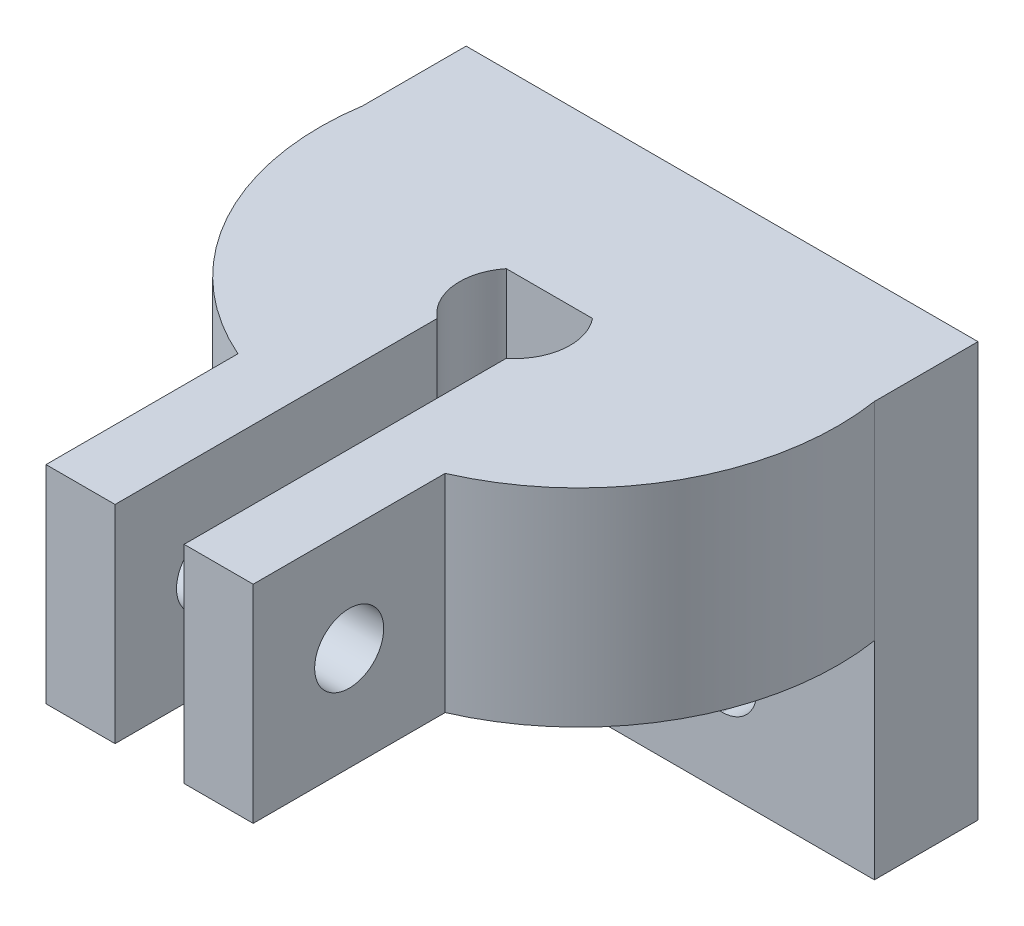
ISO-10303-21;
HEADER;
FILE_DESCRIPTION(('STEP AP214'),'2;1');
FILE_NAME('part.step','',(''),(''),'','','');
FILE_SCHEMA(('AUTOMOTIVE_DESIGN { 1 0 10303 214 1 1 1 1 }'));
ENDSEC;
DATA;
#1=APPLICATION_CONTEXT('core data for automotive mechanical design processes');
#2=APPLICATION_PROTOCOL_DEFINITION('international standard','automotive_design',2000,#1);
#3=PRODUCT_CONTEXT('',#1,'mechanical');
#4=PRODUCT('Part','Part','',(#3));
#5=PRODUCT_RELATED_PRODUCT_CATEGORY('part','',(#4));
#6=PRODUCT_DEFINITION_FORMATION('','',#4);
#7=PRODUCT_DEFINITION_CONTEXT('part definition',#1,'design');
#8=PRODUCT_DEFINITION('design','',#6,#7);
#9=PRODUCT_DEFINITION_SHAPE('','',#8);
#10=(LENGTH_UNIT() NAMED_UNIT(*) SI_UNIT(.MILLI.,.METRE.));
#11=(NAMED_UNIT(*) PLANE_ANGLE_UNIT() SI_UNIT($,.RADIAN.));
#12=(NAMED_UNIT(*) SI_UNIT($,.STERADIAN.) SOLID_ANGLE_UNIT());
#13=UNCERTAINTY_MEASURE_WITH_UNIT(LENGTH_MEASURE(1.E-05),#10,'distance_accuracy_value','');
#14=(GEOMETRIC_REPRESENTATION_CONTEXT(3) GLOBAL_UNCERTAINTY_ASSIGNED_CONTEXT((#13)) GLOBAL_UNIT_ASSIGNED_CONTEXT((#10,
#11,#12)) REPRESENTATION_CONTEXT('',''));
#15=CARTESIAN_POINT('',(0.,0.,0.));
#16=DIRECTION('',(0.,0.,1.));
#17=DIRECTION('',(1.,0.,0.));
#18=AXIS2_PLACEMENT_3D('',#15,#16,#17);
#19=CARTESIAN_POINT('',(0.,6.,0.));
#20=DIRECTION('',(0.,-1.,0.));
#21=DIRECTION('',(0.,0.,-1.));
#22=AXIS2_PLACEMENT_3D('',#19,#20,#21);
#23=CYLINDRICAL_SURFACE('',#22,7.5);
#24=DIRECTION('',(0.,-1.,0.));
#25=VECTOR('',#24,1.);
#26=CARTESIAN_POINT('',(3.,6.,6.87386354243376));
#27=LINE('',#26,#25);
#28=CARTESIAN_POINT('',(3.,0.,6.87386354243376));
#29=VERTEX_POINT('',#28);
#30=CARTESIAN_POINT('',(3.,6.,6.87386354243376));
#31=VERTEX_POINT('',#30);
#32=EDGE_CURVE('E196',#29,#31,#27,.F.);
#33=ORIENTED_EDGE('',*,*,#32,.F.);
#34=CARTESIAN_POINT('',(0.,0.,0.));
#35=DIRECTION('',(0.,1.,0.));
#36=DIRECTION('',(0.,0.,1.));
#37=AXIS2_PLACEMENT_3D('',#34,#35,#36);
#38=CIRCLE('',#37,7.5);
#39=CARTESIAN_POINT('',(7.41196235336267,0.,-1.14578098794425));
#40=VERTEX_POINT('',#39);
#41=EDGE_CURVE('E188',#29,#40,#38,.T.);
#42=ORIENTED_EDGE('',*,*,#41,.T.);
#43=DIRECTION('',(0.,-1.,0.));
#44=VECTOR('',#43,1.);
#45=CARTESIAN_POINT('',(7.41196235336267,21.1244419305527,-1.14578098794425));
#46=LINE('',#45,#44);
#47=CARTESIAN_POINT('',(7.41196235336267,6.,-1.14578098794425));
#48=VERTEX_POINT('',#47);
#49=EDGE_CURVE('E270',#48,#40,#46,.T.);
#50=ORIENTED_EDGE('',*,*,#49,.F.);
#51=CARTESIAN_POINT('',(0.,6.,0.));
#52=DIRECTION('',(0.,1.,0.));
#53=DIRECTION('',(0.,0.,1.));
#54=AXIS2_PLACEMENT_3D('',#51,#52,#53);
#55=CIRCLE('',#54,7.5);
#56=EDGE_CURVE('E314',#31,#48,#55,.T.);
#57=ORIENTED_EDGE('',*,*,#56,.F.);
#58=EDGE_LOOP('',(#33,#42,#50,#57));
#59=FACE_BOUND('',#58,.T.);
#60=ADVANCED_FACE('F35',(#59),#23,.T.);
#61=DIRECTION('',(0.,-1.,0.));
#62=VECTOR('',#61,1.);
#63=CARTESIAN_POINT('',(-3.,6.,6.87386354243376));
#64=LINE('',#63,#62);
#65=CARTESIAN_POINT('',(-3.,6.,6.87386354243376));
#66=VERTEX_POINT('',#65);
#67=CARTESIAN_POINT('',(-3.,0.,6.87386354243376));
#68=VERTEX_POINT('',#67);
#69=EDGE_CURVE('E54',#66,#68,#64,.T.);
#70=ORIENTED_EDGE('',*,*,#69,.F.);
#71=CARTESIAN_POINT('',(-7.41196235336267,6.,-1.14578098794425));
#72=VERTEX_POINT('',#71);
#73=EDGE_CURVE('E311',#72,#66,#55,.T.);
#74=ORIENTED_EDGE('',*,*,#73,.F.);
#75=DIRECTION('',(0.,-1.,0.));
#76=VECTOR('',#75,1.);
#77=CARTESIAN_POINT('',(-7.41196235336267,21.1244419305527,-1.14578098794425));
#78=LINE('',#77,#76);
#79=CARTESIAN_POINT('',(-7.41196235336267,0.,-1.14578098794425));
#80=VERTEX_POINT('',#79);
#81=EDGE_CURVE('E274',#72,#80,#78,.T.);
#82=ORIENTED_EDGE('',*,*,#81,.T.);
#83=EDGE_CURVE('E50',#80,#68,#38,.T.);
#84=ORIENTED_EDGE('',*,*,#83,.T.);
#85=EDGE_LOOP('',(#70,#74,#82,#84));
#86=FACE_BOUND('',#85,.T.);
#87=ADVANCED_FACE('F353',(#86),#23,.T.);
#88=CARTESIAN_POINT('',(0.,-2.,1.85421901205575));
#89=DIRECTION('',(0.,1.,0.));
#90=DIRECTION('',(0.,0.,1.));
#91=AXIS2_PLACEMENT_3D('',#88,#89,#90);
#92=CYLINDRICAL_SURFACE('',#91,1.6);
#93=CARTESIAN_POINT('',(0.,6.,1.85421901205575));
#94=DIRECTION('',(0.,1.,0.));
#95=DIRECTION('',(0.,0.,1.));
#96=AXIS2_PLACEMENT_3D('',#93,#94,#95);
#97=CIRCLE('',#96,1.6);
#98=CARTESIAN_POINT('',(-1.24899959967968,6.,0.854219012055751));
#99=VERTEX_POINT('',#98);
#100=CARTESIAN_POINT('',(-1.,6.,3.10321861173543));
#101=VERTEX_POINT('',#100);
#102=EDGE_CURVE('E281',#99,#101,#97,.T.);
#103=ORIENTED_EDGE('',*,*,#102,.T.);
#104=DIRECTION('',(0.,1.,0.));
#105=VECTOR('',#104,1.);
#106=CARTESIAN_POINT('',(-1.,-2.,3.10321861173543));
#107=LINE('',#106,#105);
#108=CARTESIAN_POINT('',(-1.,0.,3.10321861173543));
#109=VERTEX_POINT('',#108);
#110=EDGE_CURVE('E11',#101,#109,#107,.F.);
#111=ORIENTED_EDGE('',*,*,#110,.T.);
#112=CARTESIAN_POINT('',(0.,0.,1.85421901205575));
#113=DIRECTION('',(0.,1.,0.));
#114=DIRECTION('',(0.,0.,1.));
#115=AXIS2_PLACEMENT_3D('',#112,#113,#114);
#116=CIRCLE('',#115,1.6);
#117=CARTESIAN_POINT('',(-1.24899959967968,0.,0.854219012055751));
#118=VERTEX_POINT('',#117);
#119=EDGE_CURVE('E296',#118,#109,#116,.T.);
#120=ORIENTED_EDGE('',*,*,#119,.F.);
#121=DIRECTION('',(0.,1.,0.));
#122=VECTOR('',#121,1.);
#123=CARTESIAN_POINT('',(-1.24899959967968,-2.,0.854219012055751));
#124=LINE('',#123,#122);
#125=EDGE_CURVE('E288',#118,#99,#124,.T.);
#126=ORIENTED_EDGE('',*,*,#125,.T.);
#127=EDGE_LOOP('',(#103,#111,#120,#126));
#128=FACE_BOUND('',#127,.T.);
#129=ADVANCED_FACE('F358',(#128),#92,.F.);
#130=CARTESIAN_POINT('',(0.,0.,0.));
#131=DIRECTION('',(0.,1.,0.));
#132=DIRECTION('',(0.,0.,1.));
#133=AXIS2_PLACEMENT_3D('',#130,#131,#132);
#134=PLANE('',#133);
#135=DIRECTION('',(0.,0.,-1.));
#136=VECTOR('',#135,1.);
#137=CARTESIAN_POINT('',(1.,0.,0.));
#138=LINE('',#137,#136);
#139=CARTESIAN_POINT('',(0.999999999999999,0.,12.4330343736593));
#140=VERTEX_POINT('',#139);
#141=CARTESIAN_POINT('',(1.,0.,3.10321861173543));
#142=VERTEX_POINT('',#141);
#143=EDGE_CURVE('E221',#140,#142,#138,.T.);
#144=ORIENTED_EDGE('',*,*,#143,.T.);
#145=CARTESIAN_POINT('',(1.24899959967968,0.,0.854219012055751));
#146=VERTEX_POINT('',#145);
#147=EDGE_CURVE('E295',#142,#146,#116,.T.);
#148=ORIENTED_EDGE('',*,*,#147,.T.);
#149=DIRECTION('',(-1.,0.,0.));
#150=VECTOR('',#149,1.);
#151=CARTESIAN_POINT('',(0.,0.,0.854219012055751));
#152=LINE('',#151,#150);
#153=EDGE_CURVE('E290',#146,#118,#152,.T.);
#154=ORIENTED_EDGE('',*,*,#153,.T.);
#155=ORIENTED_EDGE('',*,*,#119,.T.);
#156=DIRECTION('',(0.,0.,1.));
#157=VECTOR('',#156,1.);
#158=CARTESIAN_POINT('',(-1.,0.,0.));
#159=LINE('',#158,#157);
#160=CARTESIAN_POINT('',(-0.999999999999999,0.,12.4330343736593));
#161=VERTEX_POINT('',#160);
#162=EDGE_CURVE('E223',#109,#161,#159,.T.);
#163=ORIENTED_EDGE('',*,*,#162,.T.);
#164=DIRECTION('',(1.,0.,0.));
#165=VECTOR('',#164,1.);
#166=CARTESIAN_POINT('',(-3.,0.,12.4330343736593));
#167=LINE('',#166,#165);
#168=CARTESIAN_POINT('',(-3.,0.,12.4330343736593));
#169=VERTEX_POINT('',#168);
#170=EDGE_CURVE('E211',#169,#161,#167,.T.);
#171=ORIENTED_EDGE('',*,*,#170,.F.);
#172=DIRECTION('',(0.,0.,-1.));
#173=VECTOR('',#172,1.);
#174=CARTESIAN_POINT('',(-3.,0.,5.43303437365925));
#175=LINE('',#174,#173);
#176=EDGE_CURVE('E205',#169,#68,#175,.T.);
#177=ORIENTED_EDGE('',*,*,#176,.T.);
#178=ORIENTED_EDGE('',*,*,#83,.F.);
#179=DIRECTION('',(-1.,0.,0.));
#180=VECTOR('',#179,1.);
#181=CARTESIAN_POINT('',(-7.41196235336267,0.,-1.14578098794425));
#182=LINE('',#181,#180);
#183=EDGE_CURVE('E299',#40,#80,#182,.T.);
#184=ORIENTED_EDGE('',*,*,#183,.F.);
#185=ORIENTED_EDGE('',*,*,#41,.F.);
#186=DIRECTION('',(0.,0.,-1.));
#187=VECTOR('',#186,1.);
#188=CARTESIAN_POINT('',(3.,0.,5.43303437365925));
#189=LINE('',#188,#187);
#190=CARTESIAN_POINT('',(3.,0.,12.4330343736593));
#191=VERTEX_POINT('',#190);
#192=EDGE_CURVE('E168',#191,#29,#189,.T.);
#193=ORIENTED_EDGE('',*,*,#192,.F.);
#194=DIRECTION('',(-1.,0.,0.));
#195=VECTOR('',#194,1.);
#196=CARTESIAN_POINT('',(3.,0.,12.4330343736593));
#197=LINE('',#196,#195);
#198=EDGE_CURVE('E178',#191,#140,#197,.T.);
#199=ORIENTED_EDGE('',*,*,#198,.T.);
#200=EDGE_LOOP('',(#144,#148,#154,#155,#163,#171,#177,#178,#184,#185,#193,#199));
#201=FACE_BOUND('',#200,.T.);
#202=ADVANCED_FACE('F186',(#201),#134,.F.);
#203=CARTESIAN_POINT('',(-6.25,6.,-4.14578098794425));
#204=DIRECTION('',(0.,0.,1.));
#205=DIRECTION('',(1.,0.,0.));
#206=AXIS2_PLACEMENT_3D('',#203,#204,#205);
#207=PLANE('',#206);
#208=DIRECTION('',(-1.,0.,0.));
#209=VECTOR('',#208,1.);
#210=CARTESIAN_POINT('',(-6.25,-2.,-4.14578098794425));
#211=LINE('',#210,#209);
#212=CARTESIAN_POINT('',(3.,-2.,-4.14578098794425));
#213=VERTEX_POINT('',#212);
#214=CARTESIAN_POINT('',(-3.,-2.,-4.14578098794425));
#215=VERTEX_POINT('',#214);
#216=EDGE_CURVE('E251',#213,#215,#211,.T.);
#217=ORIENTED_EDGE('',*,*,#216,.T.);
#218=CARTESIAN_POINT('',(-3.,-3.,-4.14578098794425));
#219=DIRECTION('',(0.,0.,1.));
#220=DIRECTION('',(1.,0.,0.));
#221=AXIS2_PLACEMENT_3D('',#218,#219,#220);
#222=CIRCLE('',#221,1.);
#223=CARTESIAN_POINT('',(-3.,-4.,-4.14578098794425));
#224=VERTEX_POINT('',#223);
#225=EDGE_CURVE('E254',#215,#224,#222,.T.);
#226=ORIENTED_EDGE('',*,*,#225,.T.);
#227=DIRECTION('',(1.,0.,0.));
#228=VECTOR('',#227,1.);
#229=CARTESIAN_POINT('',(-6.25,-4.,-4.14578098794425));
#230=LINE('',#229,#228);
#231=CARTESIAN_POINT('',(3.,-4.,-4.14578098794425));
#232=VERTEX_POINT('',#231);
#233=EDGE_CURVE('E239',#224,#232,#230,.T.);
#234=ORIENTED_EDGE('',*,*,#233,.T.);
#235=CARTESIAN_POINT('',(3.,-3.,-4.14578098794425));
#236=DIRECTION('',(0.,0.,1.));
#237=DIRECTION('',(1.,0.,0.));
#238=AXIS2_PLACEMENT_3D('',#235,#236,#237);
#239=CIRCLE('',#238,1.);
#240=EDGE_CURVE('E248',#232,#213,#239,.T.);
#241=ORIENTED_EDGE('',*,*,#240,.T.);
#242=EDGE_LOOP('',(#217,#226,#234,#241));
#243=FACE_BOUND('',#242,.T.);
#244=DIRECTION('',(-1.,0.,0.));
#245=VECTOR('',#244,1.);
#246=CARTESIAN_POINT('',(-6.25,6.,-4.14578098794425));
#247=LINE('',#246,#245);
#248=CARTESIAN_POINT('',(7.41196235336267,6.,-4.14578098794425));
#249=VERTEX_POINT('',#248);
#250=CARTESIAN_POINT('',(-7.41196235336267,6.,-4.14578098794425));
#251=VERTEX_POINT('',#250);
#252=EDGE_CURVE('E313',#249,#251,#247,.T.);
#253=ORIENTED_EDGE('',*,*,#252,.F.);
#254=DIRECTION('',(0.,-1.,0.));
#255=VECTOR('',#254,1.);
#256=CARTESIAN_POINT('',(7.41196235336267,21.1244419305527,-4.14578098794425));
#257=LINE('',#256,#255);
#258=CARTESIAN_POINT('',(7.41196235336267,-6.,-4.14578098794425));
#259=VERTEX_POINT('',#258);
#260=EDGE_CURVE('E271',#249,#259,#257,.T.);
#261=ORIENTED_EDGE('',*,*,#260,.T.);
#262=DIRECTION('',(1.,0.,0.));
#263=VECTOR('',#262,1.);
#264=CARTESIAN_POINT('',(6.25,-6.,-4.14578098794425));
#265=LINE('',#264,#263);
#266=CARTESIAN_POINT('',(-7.41196235336267,-6.,-4.14578098794425));
#267=VERTEX_POINT('',#266);
#268=EDGE_CURVE('E302',#267,#259,#265,.T.);
#269=ORIENTED_EDGE('',*,*,#268,.F.);
#270=DIRECTION('',(0.,-1.,0.));
#271=VECTOR('',#270,1.);
#272=CARTESIAN_POINT('',(-7.41196235336267,21.1244419305527,-4.14578098794425));
#273=LINE('',#272,#271);
#274=EDGE_CURVE('E266',#251,#267,#273,.T.);
#275=ORIENTED_EDGE('',*,*,#274,.F.);
#276=EDGE_LOOP('',(#253,#261,#269,#275));
#277=FACE_BOUND('',#276,.T.);
#278=ADVANCED_FACE('F367',(#243,#277),#207,.F.);
#279=CARTESIAN_POINT('',(0.,6.,0.));
#280=DIRECTION('',(0.,1.,0.));
#281=DIRECTION('',(0.,0.,1.));
#282=AXIS2_PLACEMENT_3D('',#279,#280,#281);
#283=PLANE('',#282);
#284=CARTESIAN_POINT('',(1.,6.,3.10321861173543));
#285=VERTEX_POINT('',#284);
#286=CARTESIAN_POINT('',(1.24899959967968,6.,0.854219012055751));
#287=VERTEX_POINT('',#286);
#288=EDGE_CURVE('E280',#285,#287,#97,.T.);
#289=ORIENTED_EDGE('',*,*,#288,.F.);
#290=DIRECTION('',(0.,0.,-1.));
#291=VECTOR('',#290,1.);
#292=CARTESIAN_POINT('',(1.,6.,3.10321861173543));
#293=LINE('',#292,#291);
#294=CARTESIAN_POINT('',(0.999999999999999,6.,12.4330343736593));
#295=VERTEX_POINT('',#294);
#296=EDGE_CURVE('E217',#295,#285,#293,.T.);
#297=ORIENTED_EDGE('',*,*,#296,.F.);
#298=DIRECTION('',(-1.,0.,0.));
#299=VECTOR('',#298,1.);
#300=CARTESIAN_POINT('',(3.,6.,12.4330343736593));
#301=LINE('',#300,#299);
#302=CARTESIAN_POINT('',(3.,6.,12.4330343736593));
#303=VERTEX_POINT('',#302);
#304=EDGE_CURVE('E183',#303,#295,#301,.T.);
#305=ORIENTED_EDGE('',*,*,#304,.F.);
#306=DIRECTION('',(0.,0.,1.));
#307=VECTOR('',#306,1.);
#308=CARTESIAN_POINT('',(3.,6.,5.43303437365925));
#309=LINE('',#308,#307);
#310=EDGE_CURVE('E171',#31,#303,#309,.T.);
#311=ORIENTED_EDGE('',*,*,#310,.F.);
#312=ORIENTED_EDGE('',*,*,#56,.T.);
#313=DIRECTION('',(0.,0.,1.));
#314=VECTOR('',#313,1.);
#315=CARTESIAN_POINT('',(7.41196235336267,6.,-4.14578098794425));
#316=LINE('',#315,#314);
#317=EDGE_CURVE('E267',#249,#48,#316,.T.);
#318=ORIENTED_EDGE('',*,*,#317,.F.);
#319=ORIENTED_EDGE('',*,*,#252,.T.);
#320=DIRECTION('',(0.,0.,-1.));
#321=VECTOR('',#320,1.);
#322=CARTESIAN_POINT('',(-7.41196235336267,6.,-1.14578098794425));
#323=LINE('',#322,#321);
#324=EDGE_CURVE('E261',#72,#251,#323,.T.);
#325=ORIENTED_EDGE('',*,*,#324,.F.);
#326=ORIENTED_EDGE('',*,*,#73,.T.);
#327=DIRECTION('',(0.,0.,1.));
#328=VECTOR('',#327,1.);
#329=CARTESIAN_POINT('',(-3.,6.,5.43303437365925));
#330=LINE('',#329,#328);
#331=CARTESIAN_POINT('',(-3.,6.,12.4330343736593));
#332=VERTEX_POINT('',#331);
#333=EDGE_CURVE('E200',#66,#332,#330,.T.);
#334=ORIENTED_EDGE('',*,*,#333,.T.);
#335=DIRECTION('',(1.,0.,0.));
#336=VECTOR('',#335,1.);
#337=CARTESIAN_POINT('',(-3.,6.,12.4330343736593));
#338=LINE('',#337,#336);
#339=CARTESIAN_POINT('',(-0.999999999999999,6.,12.4330343736593));
#340=VERTEX_POINT('',#339);
#341=EDGE_CURVE('E208',#332,#340,#338,.T.);
#342=ORIENTED_EDGE('',*,*,#341,.T.);
#343=DIRECTION('',(0.,0.,1.));
#344=VECTOR('',#343,1.);
#345=CARTESIAN_POINT('',(-1.,6.,7.43303437365925));
#346=LINE('',#345,#344);
#347=EDGE_CURVE('E219',#101,#340,#346,.T.);
#348=ORIENTED_EDGE('',*,*,#347,.F.);
#349=ORIENTED_EDGE('',*,*,#102,.F.);
#350=DIRECTION('',(-1.,0.,0.));
#351=VECTOR('',#350,1.);
#352=CARTESIAN_POINT('',(-1.24899959967968,6.,0.854219012055751));
#353=LINE('',#352,#351);
#354=EDGE_CURVE('E284',#287,#99,#353,.T.);
#355=ORIENTED_EDGE('',*,*,#354,.F.);
#356=EDGE_LOOP('',(#289,#297,#305,#311,#312,#318,#319,#325,#326,#334,#342,#348,#349,#355));
#357=FACE_BOUND('',#356,.T.);
#358=ADVANCED_FACE('F327',(#357),#283,.T.);
#359=CARTESIAN_POINT('',(-7.41196235336267,-6.,-1.14578098794425));
#360=DIRECTION('',(0.,0.,-1.));
#361=DIRECTION('',(-1.,0.,0.));
#362=AXIS2_PLACEMENT_3D('',#359,#360,#361);
#363=PLANE('',#362);
#364=DIRECTION('',(1.,0.,0.));
#365=VECTOR('',#364,1.);
#366=CARTESIAN_POINT('',(3.,-4.,-1.14578098794425));
#367=LINE('',#366,#365);
#368=CARTESIAN_POINT('',(-3.,-4.,-1.14578098794425));
#369=VERTEX_POINT('',#368);
#370=CARTESIAN_POINT('',(3.,-4.,-1.14578098794425));
#371=VERTEX_POINT('',#370);
#372=EDGE_CURVE('E227',#369,#371,#367,.T.);
#373=ORIENTED_EDGE('',*,*,#372,.F.);
#374=CARTESIAN_POINT('',(-3.,-3.,-1.14578098794425));
#375=DIRECTION('',(0.,0.,1.));
#376=DIRECTION('',(1.,0.,0.));
#377=AXIS2_PLACEMENT_3D('',#374,#375,#376);
#378=CIRCLE('',#377,1.);
#379=CARTESIAN_POINT('',(-3.,-2.,-1.14578098794425));
#380=VERTEX_POINT('',#379);
#381=EDGE_CURVE('E225',#380,#369,#378,.T.);
#382=ORIENTED_EDGE('',*,*,#381,.F.);
#383=DIRECTION('',(-1.,0.,0.));
#384=VECTOR('',#383,1.);
#385=CARTESIAN_POINT('',(-3.,-2.,-1.14578098794425));
#386=LINE('',#385,#384);
#387=CARTESIAN_POINT('',(3.,-2.,-1.14578098794425));
#388=VERTEX_POINT('',#387);
#389=EDGE_CURVE('E233',#388,#380,#386,.T.);
#390=ORIENTED_EDGE('',*,*,#389,.F.);
#391=CARTESIAN_POINT('',(3.,-3.,-1.14578098794425));
#392=DIRECTION('',(0.,0.,1.));
#393=DIRECTION('',(1.,0.,0.));
#394=AXIS2_PLACEMENT_3D('',#391,#392,#393);
#395=CIRCLE('',#394,1.);
#396=EDGE_CURVE('E230',#371,#388,#395,.T.);
#397=ORIENTED_EDGE('',*,*,#396,.F.);
#398=EDGE_LOOP('',(#373,#382,#390,#397));
#399=FACE_BOUND('',#398,.T.);
#400=ORIENTED_EDGE('',*,*,#183,.T.);
#401=DIRECTION('',(0.,1.,0.));
#402=VECTOR('',#401,1.);
#403=CARTESIAN_POINT('',(-7.41196235336267,-6.,-1.14578098794425));
#404=LINE('',#403,#402);
#405=CARTESIAN_POINT('',(-7.41196235336267,-6.,-1.14578098794425));
#406=VERTEX_POINT('',#405);
#407=EDGE_CURVE('E304',#406,#80,#404,.T.);
#408=ORIENTED_EDGE('',*,*,#407,.F.);
#409=DIRECTION('',(-1.,0.,0.));
#410=VECTOR('',#409,1.);
#411=CARTESIAN_POINT('',(-7.41196235336267,-6.,-1.14578098794425));
#412=LINE('',#411,#410);
#413=CARTESIAN_POINT('',(7.41196235336267,-6.,-1.14578098794425));
#414=VERTEX_POINT('',#413);
#415=EDGE_CURVE('E300',#414,#406,#412,.T.);
#416=ORIENTED_EDGE('',*,*,#415,.F.);
#417=DIRECTION('',(0.,1.,0.));
#418=VECTOR('',#417,1.);
#419=CARTESIAN_POINT('',(7.41196235336267,-6.,-1.14578098794425));
#420=LINE('',#419,#418);
#421=EDGE_CURVE('E308',#414,#40,#420,.T.);
#422=ORIENTED_EDGE('',*,*,#421,.T.);
#423=EDGE_LOOP('',(#400,#408,#416,#422));
#424=FACE_BOUND('',#423,.T.);
#425=ADVANCED_FACE('F378',(#399,#424),#363,.F.);
#426=CARTESIAN_POINT('',(0.,-6.,0.));
#427=DIRECTION('',(0.,-1.,0.));
#428=DIRECTION('',(0.,0.,-1.));
#429=AXIS2_PLACEMENT_3D('',#426,#427,#428);
#430=PLANE('',#429);
#431=ORIENTED_EDGE('',*,*,#268,.T.);
#432=DIRECTION('',(0.,0.,1.));
#433=VECTOR('',#432,1.);
#434=CARTESIAN_POINT('',(7.41196235336267,-6.,-4.14578098794425));
#435=LINE('',#434,#433);
#436=EDGE_CURVE('E258',#259,#414,#435,.T.);
#437=ORIENTED_EDGE('',*,*,#436,.T.);
#438=ORIENTED_EDGE('',*,*,#415,.T.);
#439=DIRECTION('',(0.,0.,-1.));
#440=VECTOR('',#439,1.);
#441=CARTESIAN_POINT('',(-7.41196235336267,-6.,-1.14578098794425));
#442=LINE('',#441,#440);
#443=EDGE_CURVE('E257',#406,#267,#442,.T.);
#444=ORIENTED_EDGE('',*,*,#443,.T.);
#445=EDGE_LOOP('',(#431,#437,#438,#444));
#446=FACE_BOUND('',#445,.T.);
#447=ADVANCED_FACE('F397',(#446),#430,.T.);
#448=ORIENTED_EDGE('',*,*,#147,.F.);
#449=DIRECTION('',(0.,1.,0.));
#450=VECTOR('',#449,1.);
#451=CARTESIAN_POINT('',(1.,-2.,3.10321861173543));
#452=LINE('',#451,#450);
#453=EDGE_CURVE('E43',#142,#285,#452,.T.);
#454=ORIENTED_EDGE('',*,*,#453,.T.);
#455=ORIENTED_EDGE('',*,*,#288,.T.);
#456=DIRECTION('',(0.,1.,0.));
#457=VECTOR('',#456,1.);
#458=CARTESIAN_POINT('',(1.24899959967968,-2.,0.854219012055751));
#459=LINE('',#458,#457);
#460=EDGE_CURVE('E287',#146,#287,#459,.T.);
#461=ORIENTED_EDGE('',*,*,#460,.F.);
#462=EDGE_LOOP('',(#448,#454,#455,#461));
#463=FACE_BOUND('',#462,.T.);
#464=ADVANCED_FACE('F322',(#463),#92,.F.);
#465=CARTESIAN_POINT('',(-1.24899959967968,-2.,0.854219012055751));
#466=DIRECTION('',(0.,0.,-1.));
#467=DIRECTION('',(-1.,0.,0.));
#468=AXIS2_PLACEMENT_3D('',#465,#466,#467);
#469=PLANE('',#468);
#470=ORIENTED_EDGE('',*,*,#460,.T.);
#471=ORIENTED_EDGE('',*,*,#354,.T.);
#472=ORIENTED_EDGE('',*,*,#125,.F.);
#473=ORIENTED_EDGE('',*,*,#153,.F.);
#474=EDGE_LOOP('',(#470,#471,#472,#473));
#475=FACE_BOUND('',#474,.T.);
#476=ADVANCED_FACE('F331',(#475),#469,.F.);
#477=CARTESIAN_POINT('',(7.41196235336267,21.1244419305527,-4.14578098794425));
#478=DIRECTION('',(1.,0.,0.));
#479=DIRECTION('',(0.,0.,-1.));
#480=AXIS2_PLACEMENT_3D('',#477,#478,#479);
#481=PLANE('',#480);
#482=ORIENTED_EDGE('',*,*,#260,.F.);
#483=ORIENTED_EDGE('',*,*,#317,.T.);
#484=ORIENTED_EDGE('',*,*,#49,.T.);
#485=ORIENTED_EDGE('',*,*,#421,.F.);
#486=ORIENTED_EDGE('',*,*,#436,.F.);
#487=EDGE_LOOP('',(#482,#483,#484,#485,#486));
#488=FACE_BOUND('',#487,.T.);
#489=ADVANCED_FACE('F364',(#488),#481,.T.);
#490=CARTESIAN_POINT('',(-7.41196235336267,21.1244419305527,-1.14578098794425));
#491=DIRECTION('',(-1.,0.,0.));
#492=DIRECTION('',(0.,0.,1.));
#493=AXIS2_PLACEMENT_3D('',#490,#491,#492);
#494=PLANE('',#493);
#495=ORIENTED_EDGE('',*,*,#81,.F.);
#496=ORIENTED_EDGE('',*,*,#324,.T.);
#497=ORIENTED_EDGE('',*,*,#274,.T.);
#498=ORIENTED_EDGE('',*,*,#443,.F.);
#499=ORIENTED_EDGE('',*,*,#407,.T.);
#500=EDGE_LOOP('',(#495,#496,#497,#498,#499));
#501=FACE_BOUND('',#500,.T.);
#502=ADVANCED_FACE('F373',(#501),#494,.T.);
#503=CARTESIAN_POINT('',(-3.,-3.,-11.1457809879442));
#504=DIRECTION('',(0.,0.,1.));
#505=DIRECTION('',(1.,0.,0.));
#506=AXIS2_PLACEMENT_3D('',#503,#504,#505);
#507=CYLINDRICAL_SURFACE('',#506,1.);
#508=DIRECTION('',(0.,0.,1.));
#509=VECTOR('',#508,1.);
#510=CARTESIAN_POINT('',(-3.,-2.,-11.1457809879442));
#511=LINE('',#510,#509);
#512=EDGE_CURVE('E237',#215,#380,#511,.T.);
#513=ORIENTED_EDGE('',*,*,#512,.T.);
#514=ORIENTED_EDGE('',*,*,#381,.T.);
#515=DIRECTION('',(0.,0.,1.));
#516=VECTOR('',#515,1.);
#517=CARTESIAN_POINT('',(-3.,-4.,-11.1457809879442));
#518=LINE('',#517,#516);
#519=EDGE_CURVE('E236',#224,#369,#518,.T.);
#520=ORIENTED_EDGE('',*,*,#519,.F.);
#521=ORIENTED_EDGE('',*,*,#225,.F.);
#522=EDGE_LOOP('',(#513,#514,#520,#521));
#523=FACE_BOUND('',#522,.T.);
#524=ADVANCED_FACE('F426',(#523),#507,.F.);
#525=CARTESIAN_POINT('',(-3.,-2.,-11.1457809879442));
#526=DIRECTION('',(0.,1.,0.));
#527=DIRECTION('',(0.,0.,1.));
#528=AXIS2_PLACEMENT_3D('',#525,#526,#527);
#529=PLANE('',#528);
#530=DIRECTION('',(0.,0.,1.));
#531=VECTOR('',#530,1.);
#532=CARTESIAN_POINT('',(3.,-2.,-11.1457809879442));
#533=LINE('',#532,#531);
#534=EDGE_CURVE('E240',#213,#388,#533,.T.);
#535=ORIENTED_EDGE('',*,*,#534,.T.);
#536=ORIENTED_EDGE('',*,*,#389,.T.);
#537=ORIENTED_EDGE('',*,*,#512,.F.);
#538=ORIENTED_EDGE('',*,*,#216,.F.);
#539=EDGE_LOOP('',(#535,#536,#537,#538));
#540=FACE_BOUND('',#539,.T.);
#541=ADVANCED_FACE('F418',(#540),#529,.F.);
#542=CARTESIAN_POINT('',(3.,-3.,-11.1457809879442));
#543=DIRECTION('',(0.,0.,1.));
#544=DIRECTION('',(1.,0.,0.));
#545=AXIS2_PLACEMENT_3D('',#542,#543,#544);
#546=CYLINDRICAL_SURFACE('',#545,1.);
#547=DIRECTION('',(0.,0.,1.));
#548=VECTOR('',#547,1.);
#549=CARTESIAN_POINT('',(3.,-4.,-11.1457809879442));
#550=LINE('',#549,#548);
#551=EDGE_CURVE('E242',#232,#371,#550,.T.);
#552=ORIENTED_EDGE('',*,*,#551,.T.);
#553=ORIENTED_EDGE('',*,*,#396,.T.);
#554=ORIENTED_EDGE('',*,*,#534,.F.);
#555=ORIENTED_EDGE('',*,*,#240,.F.);
#556=EDGE_LOOP('',(#552,#553,#554,#555));
#557=FACE_BOUND('',#556,.T.);
#558=ADVANCED_FACE('F347',(#557),#546,.F.);
#559=CARTESIAN_POINT('',(3.,-4.,-11.1457809879442));
#560=DIRECTION('',(0.,-1.,0.));
#561=DIRECTION('',(0.,0.,-1.));
#562=AXIS2_PLACEMENT_3D('',#559,#560,#561);
#563=PLANE('',#562);
#564=ORIENTED_EDGE('',*,*,#519,.T.);
#565=ORIENTED_EDGE('',*,*,#372,.T.);
#566=ORIENTED_EDGE('',*,*,#551,.F.);
#567=ORIENTED_EDGE('',*,*,#233,.F.);
#568=EDGE_LOOP('',(#564,#565,#566,#567));
#569=FACE_BOUND('',#568,.T.);
#570=ADVANCED_FACE('F337',(#569),#563,.F.);
#571=CARTESIAN_POINT('',(1.,-6.,3.10321861173543));
#572=DIRECTION('',(1.,0.,0.));
#573=DIRECTION('',(0.,0.,-1.));
#574=AXIS2_PLACEMENT_3D('',#571,#572,#573);
#575=PLANE('',#574);
#576=CARTESIAN_POINT('',(1.,3.,9.6534489580465));
#577=DIRECTION('',(1.,0.,0.));
#578=DIRECTION('',(0.,0.,-1.));
#579=AXIS2_PLACEMENT_3D('',#576,#577,#578);
#580=CIRCLE('',#579,1.);
#581=CARTESIAN_POINT('',(1.,3.,10.6534489580465));
#582=VERTEX_POINT('',#581);
#583=EDGE_CURVE('E190',#582,#582,#580,.T.);
#584=ORIENTED_EDGE('',*,*,#583,.T.);
#585=EDGE_LOOP('',(#584));
#586=FACE_BOUND('',#585,.T.);
#587=ORIENTED_EDGE('',*,*,#296,.T.);
#588=ORIENTED_EDGE('',*,*,#453,.F.);
#589=ORIENTED_EDGE('',*,*,#143,.F.);
#590=DIRECTION('',(0.,-1.,0.));
#591=VECTOR('',#590,1.);
#592=CARTESIAN_POINT('',(0.999999999999999,0.,12.4330343736593));
#593=LINE('',#592,#591);
#594=EDGE_CURVE('E181',#295,#140,#593,.T.);
#595=ORIENTED_EDGE('',*,*,#594,.F.);
#596=EDGE_LOOP('',(#587,#588,#589,#595));
#597=FACE_BOUND('',#596,.T.);
#598=ADVANCED_FACE('F334',(#586,#597),#575,.F.);
#599=CARTESIAN_POINT('',(-1.,-6.,7.43303437365925));
#600=DIRECTION('',(-1.,0.,0.));
#601=DIRECTION('',(0.,0.,1.));
#602=AXIS2_PLACEMENT_3D('',#599,#600,#601);
#603=PLANE('',#602);
#604=CARTESIAN_POINT('',(-0.999999999999999,3.,9.65344895804651));
#605=DIRECTION('',(-1.,0.,0.));
#606=DIRECTION('',(0.,0.,1.));
#607=AXIS2_PLACEMENT_3D('',#604,#605,#606);
#608=CIRCLE('',#607,1.);
#609=CARTESIAN_POINT('',(-0.999999999999997,3.,10.6534489580465));
#610=VERTEX_POINT('',#609);
#611=EDGE_CURVE('E592',#610,#610,#608,.T.);
#612=ORIENTED_EDGE('',*,*,#611,.T.);
#613=EDGE_LOOP('',(#612));
#614=FACE_BOUND('',#613,.T.);
#615=ORIENTED_EDGE('',*,*,#347,.T.);
#616=DIRECTION('',(0.,-1.,0.));
#617=VECTOR('',#616,1.);
#618=CARTESIAN_POINT('',(-0.999999999999999,0.,12.4330343736593));
#619=LINE('',#618,#617);
#620=EDGE_CURVE('E199',#340,#161,#619,.T.);
#621=ORIENTED_EDGE('',*,*,#620,.T.);
#622=ORIENTED_EDGE('',*,*,#162,.F.);
#623=ORIENTED_EDGE('',*,*,#110,.F.);
#624=EDGE_LOOP('',(#615,#621,#622,#623));
#625=FACE_BOUND('',#624,.T.);
#626=ADVANCED_FACE('F336',(#614,#625),#603,.F.);
#627=CARTESIAN_POINT('',(-3.,0.,0.));
#628=DIRECTION('',(1.,0.,0.));
#629=DIRECTION('',(0.,0.,-1.));
#630=AXIS2_PLACEMENT_3D('',#627,#628,#629);
#631=PLANE('',#630);
#632=CARTESIAN_POINT('',(-3.,3.,9.65344895804651));
#633=DIRECTION('',(-1.,0.,0.));
#634=DIRECTION('',(0.,0.,1.));
#635=AXIS2_PLACEMENT_3D('',#632,#633,#634);
#636=CIRCLE('',#635,1.);
#637=CARTESIAN_POINT('',(-3.,3.,10.6534489580465));
#638=VERTEX_POINT('',#637);
#639=EDGE_CURVE('E589',#638,#638,#636,.T.);
#640=ORIENTED_EDGE('',*,*,#639,.F.);
#641=EDGE_LOOP('',(#640));
#642=FACE_BOUND('',#641,.T.);
#643=ORIENTED_EDGE('',*,*,#333,.F.);
#644=ORIENTED_EDGE('',*,*,#69,.T.);
#645=ORIENTED_EDGE('',*,*,#176,.F.);
#646=DIRECTION('',(0.,-1.,0.));
#647=VECTOR('',#646,1.);
#648=CARTESIAN_POINT('',(-3.,0.,12.4330343736593));
#649=LINE('',#648,#647);
#650=EDGE_CURVE('E202',#332,#169,#649,.T.);
#651=ORIENTED_EDGE('',*,*,#650,.F.);
#652=EDGE_LOOP('',(#643,#644,#645,#651));
#653=FACE_BOUND('',#652,.T.);
#654=ADVANCED_FACE('F344',(#642,#653),#631,.F.);
#655=CARTESIAN_POINT('',(-3.,0.,12.4330343736593));
#656=DIRECTION('',(0.,0.,1.));
#657=DIRECTION('',(1.,0.,0.));
#658=AXIS2_PLACEMENT_3D('',#655,#656,#657);
#659=PLANE('',#658);
#660=ORIENTED_EDGE('',*,*,#620,.F.);
#661=ORIENTED_EDGE('',*,*,#341,.F.);
#662=ORIENTED_EDGE('',*,*,#650,.T.);
#663=ORIENTED_EDGE('',*,*,#170,.T.);
#664=EDGE_LOOP('',(#660,#661,#662,#663));
#665=FACE_BOUND('',#664,.T.);
#666=ADVANCED_FACE('F385',(#665),#659,.T.);
#667=CARTESIAN_POINT('',(3.,0.,0.));
#668=DIRECTION('',(-1.,0.,0.));
#669=DIRECTION('',(0.,0.,-1.));
#670=AXIS2_PLACEMENT_3D('',#667,#668,#669);
#671=PLANE('',#670);
#672=CARTESIAN_POINT('',(3.,3.,9.6534489580465));
#673=DIRECTION('',(-1.,0.,0.));
#674=DIRECTION('',(0.,0.,1.));
#675=AXIS2_PLACEMENT_3D('',#672,#673,#674);
#676=CIRCLE('',#675,1.);
#677=CARTESIAN_POINT('',(3.,3.,10.6534489580465));
#678=VERTEX_POINT('',#677);
#679=EDGE_CURVE('E38',#678,#678,#676,.T.);
#680=ORIENTED_EDGE('',*,*,#679,.T.);
#681=EDGE_LOOP('',(#680));
#682=FACE_BOUND('',#681,.T.);
#683=ORIENTED_EDGE('',*,*,#192,.T.);
#684=ORIENTED_EDGE('',*,*,#32,.T.);
#685=ORIENTED_EDGE('',*,*,#310,.T.);
#686=DIRECTION('',(0.,-1.,0.));
#687=VECTOR('',#686,1.);
#688=CARTESIAN_POINT('',(3.,0.,12.4330343736593));
#689=LINE('',#688,#687);
#690=EDGE_CURVE('E164',#303,#191,#689,.T.);
#691=ORIENTED_EDGE('',*,*,#690,.T.);
#692=EDGE_LOOP('',(#683,#684,#685,#691));
#693=FACE_BOUND('',#692,.T.);
#694=ADVANCED_FACE('F166',(#682,#693),#671,.F.);
#695=CARTESIAN_POINT('',(3.,0.,12.4330343736593));
#696=DIRECTION('',(0.,0.,-1.));
#697=DIRECTION('',(-1.,0.,0.));
#698=AXIS2_PLACEMENT_3D('',#695,#696,#697);
#699=PLANE('',#698);
#700=ORIENTED_EDGE('',*,*,#594,.T.);
#701=ORIENTED_EDGE('',*,*,#198,.F.);
#702=ORIENTED_EDGE('',*,*,#690,.F.);
#703=ORIENTED_EDGE('',*,*,#304,.T.);
#704=EDGE_LOOP('',(#700,#701,#702,#703));
#705=FACE_BOUND('',#704,.T.);
#706=ADVANCED_FACE('F179',(#705),#699,.F.);
#707=CARTESIAN_POINT('',(7.5,3.,9.6534489580465));
#708=DIRECTION('',(-1.,0.,0.));
#709=DIRECTION('',(0.,0.,1.));
#710=AXIS2_PLACEMENT_3D('',#707,#708,#709);
#711=CYLINDRICAL_SURFACE('',#710,1.);
#712=CARTESIAN_POINT('',(3.,3.,10.6534489580465));
#713=CARTESIAN_POINT('',(2.97916666666667,3.,10.6534489580465));
#714=CARTESIAN_POINT('',(2.95833333333333,3.,10.6534489580465));
#715=CARTESIAN_POINT('',(2.91666666666667,3.,10.6534489580465));
#716=CARTESIAN_POINT('',(2.89583333333333,3.,10.6534489580465));
#717=CARTESIAN_POINT('',(2.85416666666667,3.,10.6534489580465));
#718=CARTESIAN_POINT('',(2.83333333333333,3.,10.6534489580465));
#719=CARTESIAN_POINT('',(2.79166666666667,3.,10.6534489580465));
#720=CARTESIAN_POINT('',(2.77083333333333,3.,10.6534489580465));
#721=CARTESIAN_POINT('',(2.72916666666667,3.,10.6534489580465));
#722=CARTESIAN_POINT('',(2.70833333333333,3.,10.6534489580465));
#723=CARTESIAN_POINT('',(2.66666666666667,3.,10.6534489580465));
#724=CARTESIAN_POINT('',(2.64583333333333,3.,10.6534489580465));
#725=CARTESIAN_POINT('',(2.60416666666667,3.,10.6534489580465));
#726=CARTESIAN_POINT('',(2.58333333333333,3.,10.6534489580465));
#727=CARTESIAN_POINT('',(2.54166666666667,3.,10.6534489580465));
#728=CARTESIAN_POINT('',(2.52083333333333,3.,10.6534489580465));
#729=CARTESIAN_POINT('',(2.47916666666667,3.,10.6534489580465));
#730=CARTESIAN_POINT('',(2.45833333333333,3.,10.6534489580465));
#731=CARTESIAN_POINT('',(2.41666666666667,3.,10.6534489580465));
#732=CARTESIAN_POINT('',(2.39583333333333,3.,10.6534489580465));
#733=CARTESIAN_POINT('',(2.35416666666667,3.,10.6534489580465));
#734=CARTESIAN_POINT('',(2.33333333333333,3.,10.6534489580465));
#735=CARTESIAN_POINT('',(2.29166666666667,3.,10.6534489580465));
#736=CARTESIAN_POINT('',(2.27083333333333,3.,10.6534489580465));
#737=CARTESIAN_POINT('',(2.22916666666667,3.,10.6534489580465));
#738=CARTESIAN_POINT('',(2.20833333333333,3.,10.6534489580465));
#739=CARTESIAN_POINT('',(2.16666666666667,3.,10.6534489580465));
#740=CARTESIAN_POINT('',(2.14583333333333,3.,10.6534489580465));
#741=CARTESIAN_POINT('',(2.10416666666667,3.,10.6534489580465));
#742=CARTESIAN_POINT('',(2.08333333333333,3.,10.6534489580465));
#743=CARTESIAN_POINT('',(2.04166666666667,3.,10.6534489580465));
#744=CARTESIAN_POINT('',(2.02083333333333,3.,10.6534489580465));
#745=CARTESIAN_POINT('',(1.97916666666667,3.,10.6534489580465));
#746=CARTESIAN_POINT('',(1.95833333333333,3.,10.6534489580465));
#747=CARTESIAN_POINT('',(1.91666666666667,3.,10.6534489580465));
#748=CARTESIAN_POINT('',(1.89583333333333,3.,10.6534489580465));
#749=CARTESIAN_POINT('',(1.85416666666667,3.,10.6534489580465));
#750=CARTESIAN_POINT('',(1.83333333333333,3.,10.6534489580465));
#751=CARTESIAN_POINT('',(1.79166666666667,3.,10.6534489580465));
#752=CARTESIAN_POINT('',(1.77083333333333,3.,10.6534489580465));
#753=CARTESIAN_POINT('',(1.72916666666667,3.,10.6534489580465));
#754=CARTESIAN_POINT('',(1.70833333333333,3.,10.6534489580465));
#755=CARTESIAN_POINT('',(1.66666666666667,3.,10.6534489580465));
#756=CARTESIAN_POINT('',(1.64583333333333,3.,10.6534489580465));
#757=CARTESIAN_POINT('',(1.60416666666667,3.,10.6534489580465));
#758=CARTESIAN_POINT('',(1.58333333333333,3.,10.6534489580465));
#759=CARTESIAN_POINT('',(1.54166666666667,3.,10.6534489580465));
#760=CARTESIAN_POINT('',(1.52083333333333,3.,10.6534489580465));
#761=CARTESIAN_POINT('',(1.47916666666667,3.,10.6534489580465));
#762=CARTESIAN_POINT('',(1.45833333333333,3.,10.6534489580465));
#763=CARTESIAN_POINT('',(1.41666666666667,3.,10.6534489580465));
#764=CARTESIAN_POINT('',(1.39583333333333,3.,10.6534489580465));
#765=CARTESIAN_POINT('',(1.35416666666667,3.,10.6534489580465));
#766=CARTESIAN_POINT('',(1.33333333333333,3.,10.6534489580465));
#767=CARTESIAN_POINT('',(1.29166666666667,3.,10.6534489580465));
#768=CARTESIAN_POINT('',(1.27083333333333,3.,10.6534489580465));
#769=CARTESIAN_POINT('',(1.22916666666667,3.,10.6534489580465));
#770=CARTESIAN_POINT('',(1.20833333333333,3.,10.6534489580465));
#771=CARTESIAN_POINT('',(1.16666666666667,3.,10.6534489580465));
#772=CARTESIAN_POINT('',(1.14583333333333,3.,10.6534489580465));
#773=CARTESIAN_POINT('',(1.10416666666667,3.,10.6534489580465));
#774=CARTESIAN_POINT('',(1.08333333333333,3.,10.6534489580465));
#775=CARTESIAN_POINT('',(1.04166666666667,3.,10.6534489580465));
#776=CARTESIAN_POINT('',(1.02083333333333,3.,10.6534489580465));
#777=CARTESIAN_POINT('',(1.,3.,10.6534489580465));
#778=B_SPLINE_CURVE_WITH_KNOTS('',3,(#712,#713,#714,#715,#716,#717,#718,#719,#720,#721,#722,
#723,#724,#725,#726,#727,#728,#729,#730,#731,#732,#733,#734,#735,#736,#737,#738,#739,#740,#741,
#742,#743,#744,#745,#746,#747,#748,#749,#750,#751,#752,#753,#754,#755,#756,#757,#758,#759,#760,
#761,#762,#763,#764,#765,#766,#767,#768,#769,#770,#771,#772,#773,#774,#775,#776,#777),
.UNSPECIFIED.,.F.,.F.,(4,2,2,2,2,2,2,2,2,2,2,2,2,2,2,2,2,2,2,2,2,2,2,2,2,2,2,2,2,2,2,2,4),(0.,
0.0625000000000001,0.125,0.1875,0.25,0.3125,0.375,0.4375,0.5,0.5625,0.625,0.6875,0.75,0.8125,
0.875,0.9375,1.,1.0625,1.125,1.1875,1.25,1.3125,1.375,1.4375,1.5,1.5625,1.625,1.6875,1.75,
1.8125,1.875,1.9375,2.),.UNSPECIFIED.);
#779=EDGE_CURVE('BSEAM538',#678,#582,#778,.T.);
#780=ORIENTED_EDGE('',*,*,#679,.F.);
#781=ORIENTED_EDGE('',*,*,#583,.F.);
#782=ORIENTED_EDGE('',*,*,#779,.T.);
#783=ORIENTED_EDGE('',*,*,#779,.F.);
#784=EDGE_LOOP('',(#780,#782,#781,#783));
#785=FACE_BOUND('',#784,.T.);
#786=ADVANCED_FACE('F538',(#785),#711,.F.);
#787=CARTESIAN_POINT('',(-3.,3.,10.6534489580465));
#788=CARTESIAN_POINT('',(-2.97916666666667,3.,10.6534489580465));
#789=CARTESIAN_POINT('',(-2.95833333333333,3.,10.6534489580465));
#790=CARTESIAN_POINT('',(-2.91666666666667,3.,10.6534489580465));
#791=CARTESIAN_POINT('',(-2.89583333333333,3.,10.6534489580465));
#792=CARTESIAN_POINT('',(-2.85416666666667,3.,10.6534489580465));
#793=CARTESIAN_POINT('',(-2.83333333333333,3.,10.6534489580465));
#794=CARTESIAN_POINT('',(-2.79166666666667,3.,10.6534489580465));
#795=CARTESIAN_POINT('',(-2.77083333333333,3.,10.6534489580465));
#796=CARTESIAN_POINT('',(-2.72916666666667,3.,10.6534489580465));
#797=CARTESIAN_POINT('',(-2.70833333333333,3.,10.6534489580465));
#798=CARTESIAN_POINT('',(-2.66666666666667,3.,10.6534489580465));
#799=CARTESIAN_POINT('',(-2.64583333333333,3.,10.6534489580465));
#800=CARTESIAN_POINT('',(-2.60416666666667,3.,10.6534489580465));
#801=CARTESIAN_POINT('',(-2.58333333333333,3.,10.6534489580465));
#802=CARTESIAN_POINT('',(-2.54166666666667,3.,10.6534489580465));
#803=CARTESIAN_POINT('',(-2.52083333333333,3.,10.6534489580465));
#804=CARTESIAN_POINT('',(-2.47916666666667,3.,10.6534489580465));
#805=CARTESIAN_POINT('',(-2.45833333333333,3.,10.6534489580465));
#806=CARTESIAN_POINT('',(-2.41666666666667,3.,10.6534489580465));
#807=CARTESIAN_POINT('',(-2.39583333333333,3.,10.6534489580465));
#808=CARTESIAN_POINT('',(-2.35416666666667,3.,10.6534489580465));
#809=CARTESIAN_POINT('',(-2.33333333333333,3.,10.6534489580465));
#810=CARTESIAN_POINT('',(-2.29166666666667,3.,10.6534489580465));
#811=CARTESIAN_POINT('',(-2.27083333333333,3.,10.6534489580465));
#812=CARTESIAN_POINT('',(-2.22916666666667,3.,10.6534489580465));
#813=CARTESIAN_POINT('',(-2.20833333333333,3.,10.6534489580465));
#814=CARTESIAN_POINT('',(-2.16666666666667,3.,10.6534489580465));
#815=CARTESIAN_POINT('',(-2.14583333333333,3.,10.6534489580465));
#816=CARTESIAN_POINT('',(-2.10416666666667,3.,10.6534489580465));
#817=CARTESIAN_POINT('',(-2.08333333333333,3.,10.6534489580465));
#818=CARTESIAN_POINT('',(-2.04166666666667,3.,10.6534489580465));
#819=CARTESIAN_POINT('',(-2.02083333333333,3.,10.6534489580465));
#820=CARTESIAN_POINT('',(-1.97916666666667,3.,10.6534489580465));
#821=CARTESIAN_POINT('',(-1.95833333333333,3.,10.6534489580465));
#822=CARTESIAN_POINT('',(-1.91666666666666,3.,10.6534489580465));
#823=CARTESIAN_POINT('',(-1.89583333333333,3.,10.6534489580465));
#824=CARTESIAN_POINT('',(-1.85416666666666,3.,10.6534489580465));
#825=CARTESIAN_POINT('',(-1.83333333333333,3.,10.6534489580465));
#826=CARTESIAN_POINT('',(-1.79166666666666,3.,10.6534489580465));
#827=CARTESIAN_POINT('',(-1.77083333333333,3.,10.6534489580465));
#828=CARTESIAN_POINT('',(-1.72916666666666,3.,10.6534489580465));
#829=CARTESIAN_POINT('',(-1.70833333333333,3.,10.6534489580465));
#830=CARTESIAN_POINT('',(-1.66666666666666,3.,10.6534489580465));
#831=CARTESIAN_POINT('',(-1.64583333333333,3.,10.6534489580465));
#832=CARTESIAN_POINT('',(-1.60416666666666,3.,10.6534489580465));
#833=CARTESIAN_POINT('',(-1.58333333333333,3.,10.6534489580465));
#834=CARTESIAN_POINT('',(-1.54166666666666,3.,10.6534489580465));
#835=CARTESIAN_POINT('',(-1.52083333333333,3.,10.6534489580465));
#836=CARTESIAN_POINT('',(-1.47916666666666,3.,10.6534489580465));
#837=CARTESIAN_POINT('',(-1.45833333333333,3.,10.6534489580465));
#838=CARTESIAN_POINT('',(-1.41666666666666,3.,10.6534489580465));
#839=CARTESIAN_POINT('',(-1.39583333333333,3.,10.6534489580465));
#840=CARTESIAN_POINT('',(-1.35416666666666,3.,10.6534489580465));
#841=CARTESIAN_POINT('',(-1.33333333333333,3.,10.6534489580465));
#842=CARTESIAN_POINT('',(-1.29166666666666,3.,10.6534489580465));
#843=CARTESIAN_POINT('',(-1.27083333333333,3.,10.6534489580465));
#844=CARTESIAN_POINT('',(-1.22916666666666,3.,10.6534489580465));
#845=CARTESIAN_POINT('',(-1.20833333333333,3.,10.6534489580465));
#846=CARTESIAN_POINT('',(-1.16666666666666,3.,10.6534489580465));
#847=CARTESIAN_POINT('',(-1.14583333333333,3.,10.6534489580465));
#848=CARTESIAN_POINT('',(-1.10416666666666,3.,10.6534489580465));
#849=CARTESIAN_POINT('',(-1.08333333333333,3.,10.6534489580465));
#850=CARTESIAN_POINT('',(-1.04166666666666,3.,10.6534489580465));
#851=CARTESIAN_POINT('',(-1.02083333333333,3.,10.6534489580465));
#852=CARTESIAN_POINT('',(-0.999999999999997,3.,10.6534489580465));
#853=B_SPLINE_CURVE_WITH_KNOTS('',3,(#787,#788,#789,#790,#791,#792,#793,#794,#795,#796,#797,
#798,#799,#800,#801,#802,#803,#804,#805,#806,#807,#808,#809,#810,#811,#812,#813,#814,#815,#816,
#817,#818,#819,#820,#821,#822,#823,#824,#825,#826,#827,#828,#829,#830,#831,#832,#833,#834,#835,
#836,#837,#838,#839,#840,#841,#842,#843,#844,#845,#846,#847,#848,#849,#850,#851,#852),
.UNSPECIFIED.,.F.,.F.,(4,2,2,2,2,2,2,2,2,2,2,2,2,2,2,2,2,2,2,2,2,2,2,2,2,2,2,2,2,2,2,2,4),(0.,
0.0625000000000001,0.125,0.1875,0.25,0.3125,0.375,0.4375,0.5,0.5625,0.625000000000001,
0.687500000000001,0.750000000000001,0.812500000000001,0.875000000000001,0.937500000000001,1.,
1.0625,1.125,1.1875,1.25,1.3125,1.375,1.4375,1.5,1.5625,1.625,1.6875,1.75,1.8125,1.875,1.9375,
2.),.UNSPECIFIED.);
#854=EDGE_CURVE('BSEAM573',#638,#610,#853,.T.);
#855=ORIENTED_EDGE('',*,*,#639,.T.);
#856=ORIENTED_EDGE('',*,*,#611,.F.);
#857=ORIENTED_EDGE('',*,*,#854,.T.);
#858=ORIENTED_EDGE('',*,*,#854,.F.);
#859=EDGE_LOOP('',(#855,#857,#856,#858));
#860=FACE_BOUND('',#859,.T.);
#861=ADVANCED_FACE('F573',(#860),#711,.F.);
#862=CLOSED_SHELL('',(#60,#87,#129,#202,#278,#358,#425,#447,#464,#476,#489,#502,#524,#541,#558,
#570,#598,#626,#654,#666,#694,#706,#786,#861));
#863=MANIFOLD_SOLID_BREP('B2',#862);
#864=ADVANCED_BREP_SHAPE_REPRESENTATION('',(#18,#863),#14);
#865=SHAPE_DEFINITION_REPRESENTATION(#9,#864);
ENDSEC;
END-ISO-10303-21;
